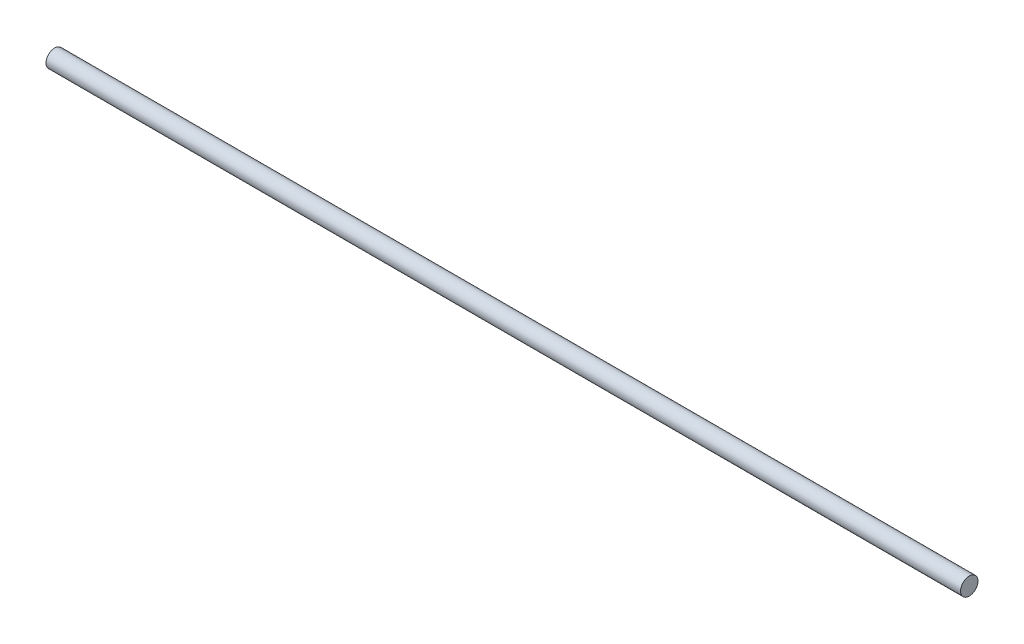
ISO-10303-21;
HEADER;
FILE_DESCRIPTION(('STEP AP214'),'2;1');
FILE_NAME('part.step','',(''),(''),'','','');
FILE_SCHEMA(('AUTOMOTIVE_DESIGN { 1 0 10303 214 1 1 1 1 }'));
ENDSEC;
DATA;
#1=APPLICATION_CONTEXT('core data for automotive mechanical design processes');
#2=APPLICATION_PROTOCOL_DEFINITION('international standard','automotive_design',2000,#1);
#3=PRODUCT_CONTEXT('',#1,'mechanical');
#4=PRODUCT('Part','Part','',(#3));
#5=PRODUCT_RELATED_PRODUCT_CATEGORY('part','',(#4));
#6=PRODUCT_DEFINITION_FORMATION('','',#4);
#7=PRODUCT_DEFINITION_CONTEXT('part definition',#1,'design');
#8=PRODUCT_DEFINITION('design','',#6,#7);
#9=PRODUCT_DEFINITION_SHAPE('','',#8);
#10=(LENGTH_UNIT() NAMED_UNIT(*) SI_UNIT(.MILLI.,.METRE.));
#11=(NAMED_UNIT(*) PLANE_ANGLE_UNIT() SI_UNIT($,.RADIAN.));
#12=(NAMED_UNIT(*) SI_UNIT($,.STERADIAN.) SOLID_ANGLE_UNIT());
#13=UNCERTAINTY_MEASURE_WITH_UNIT(LENGTH_MEASURE(1.E-05),#10,'distance_accuracy_value','');
#14=(GEOMETRIC_REPRESENTATION_CONTEXT(3) GLOBAL_UNCERTAINTY_ASSIGNED_CONTEXT((#13)) GLOBAL_UNIT_ASSIGNED_CONTEXT((#10,
#11,#12)) REPRESENTATION_CONTEXT('',''));
#15=CARTESIAN_POINT('',(0.,0.,0.));
#16=DIRECTION('',(0.,0.,1.));
#17=DIRECTION('',(1.,0.,0.));
#18=AXIS2_PLACEMENT_3D('',#15,#16,#17);
#19=CARTESIAN_POINT('',(420.,0.,0.));
#20=DIRECTION('',(-1.,0.,0.));
#21=DIRECTION('',(0.,0.,1.));
#22=AXIS2_PLACEMENT_3D('',#19,#20,#21);
#23=CYLINDRICAL_SURFACE('',#22,4.);
#24=CARTESIAN_POINT('',(420.,0.,0.));
#25=DIRECTION('',(1.,0.,0.));
#26=DIRECTION('',(0.,0.,-1.));
#27=AXIS2_PLACEMENT_3D('',#24,#25,#26);
#28=CIRCLE('',#27,4.);
#29=CARTESIAN_POINT('',(420.,0.,-4.));
#30=VERTEX_POINT('',#29);
#31=EDGE_CURVE('E10',#30,#30,#28,.T.);
#32=ORIENTED_EDGE('',*,*,#31,.F.);
#33=EDGE_LOOP('',(#32));
#34=FACE_BOUND('',#33,.T.);
#35=CARTESIAN_POINT('',(0.,0.,0.));
#36=DIRECTION('',(1.,0.,0.));
#37=DIRECTION('',(0.,0.,-1.));
#38=AXIS2_PLACEMENT_3D('',#35,#36,#37);
#39=CIRCLE('',#38,4.);
#40=CARTESIAN_POINT('',(0.,0.,-4.));
#41=VERTEX_POINT('',#40);
#42=EDGE_CURVE('E39',#41,#41,#39,.T.);
#43=ORIENTED_EDGE('',*,*,#42,.T.);
#44=EDGE_LOOP('',(#43));
#45=FACE_BOUND('',#44,.T.);
#46=ADVANCED_FACE('F38',(#34,#45),#23,.T.);
#47=CARTESIAN_POINT('',(420.,0.,0.));
#48=DIRECTION('',(1.,0.,0.));
#49=DIRECTION('',(0.,0.,-1.));
#50=AXIS2_PLACEMENT_3D('',#47,#48,#49);
#51=PLANE('',#50);
#52=ORIENTED_EDGE('',*,*,#31,.T.);
#53=EDGE_LOOP('',(#52));
#54=FACE_BOUND('',#53,.T.);
#55=ADVANCED_FACE('F51',(#54),#51,.T.);
#56=CARTESIAN_POINT('',(0.,0.,0.));
#57=DIRECTION('',(1.,0.,0.));
#58=DIRECTION('',(0.,0.,-1.));
#59=AXIS2_PLACEMENT_3D('',#56,#57,#58);
#60=PLANE('',#59);
#61=ORIENTED_EDGE('',*,*,#42,.F.);
#62=EDGE_LOOP('',(#61));
#63=FACE_BOUND('',#62,.T.);
#64=ADVANCED_FACE('F47',(#63),#60,.F.);
#65=CLOSED_SHELL('',(#46,#55,#64));
#66=MANIFOLD_SOLID_BREP('B2',#65);
#67=ADVANCED_BREP_SHAPE_REPRESENTATION('',(#18,#66),#14);
#68=SHAPE_DEFINITION_REPRESENTATION(#9,#67);
ENDSEC;
END-ISO-10303-21;
